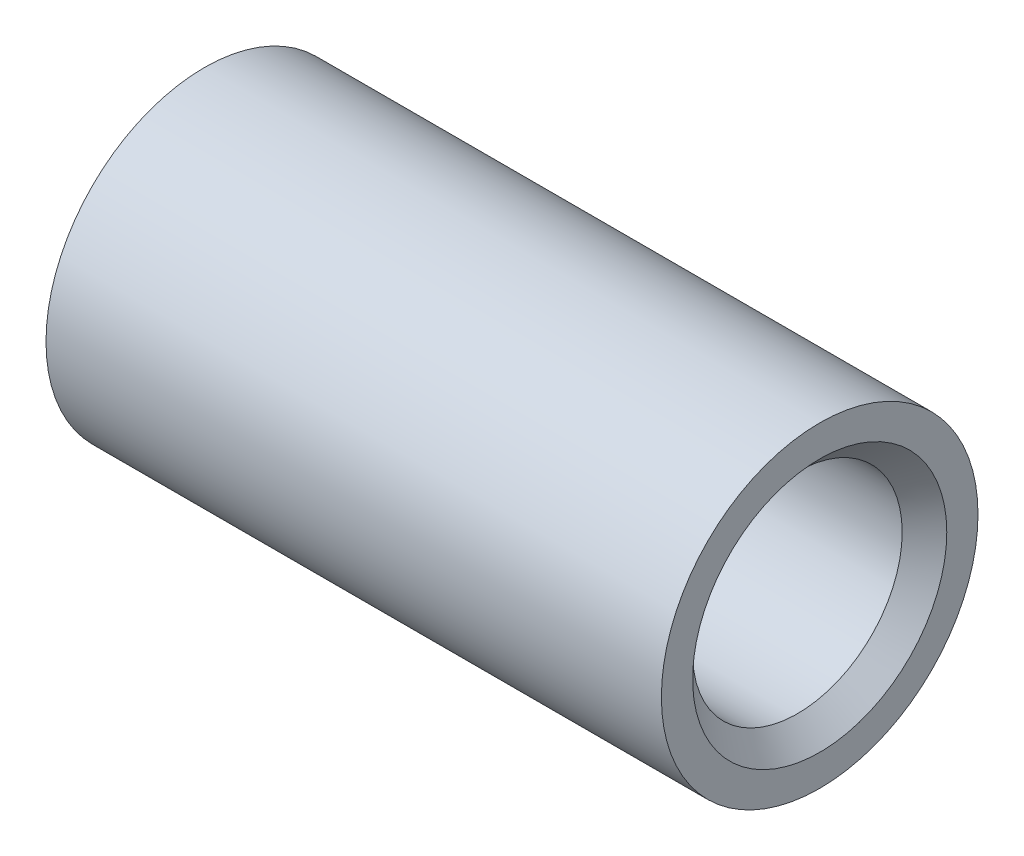
ISO-10303-21;
HEADER;
FILE_DESCRIPTION(('STEP AP214'),'2;1');
FILE_NAME('part.step','',(''),(''),'','','');
FILE_SCHEMA(('AUTOMOTIVE_DESIGN { 1 0 10303 214 1 1 1 1 }'));
ENDSEC;
DATA;
#1=APPLICATION_CONTEXT('core data for automotive mechanical design processes');
#2=APPLICATION_PROTOCOL_DEFINITION('international standard','automotive_design',2000,#1);
#3=PRODUCT_CONTEXT('',#1,'mechanical');
#4=PRODUCT('Part','Part','',(#3));
#5=PRODUCT_RELATED_PRODUCT_CATEGORY('part','',(#4));
#6=PRODUCT_DEFINITION_FORMATION('','',#4);
#7=PRODUCT_DEFINITION_CONTEXT('part definition',#1,'design');
#8=PRODUCT_DEFINITION('design','',#6,#7);
#9=PRODUCT_DEFINITION_SHAPE('','',#8);
#10=(LENGTH_UNIT() NAMED_UNIT(*) SI_UNIT(.MILLI.,.METRE.));
#11=(NAMED_UNIT(*) PLANE_ANGLE_UNIT() SI_UNIT($,.RADIAN.));
#12=(NAMED_UNIT(*) SI_UNIT($,.STERADIAN.) SOLID_ANGLE_UNIT());
#13=UNCERTAINTY_MEASURE_WITH_UNIT(LENGTH_MEASURE(1.E-05),#10,'distance_accuracy_value','');
#14=(GEOMETRIC_REPRESENTATION_CONTEXT(3) GLOBAL_UNCERTAINTY_ASSIGNED_CONTEXT((#13)) GLOBAL_UNIT_ASSIGNED_CONTEXT((#10,
#11,#12)) REPRESENTATION_CONTEXT('',''));
#15=CARTESIAN_POINT('',(0.,0.,0.));
#16=DIRECTION('',(0.,0.,1.));
#17=DIRECTION('',(1.,0.,0.));
#18=AXIS2_PLACEMENT_3D('',#15,#16,#17);
#19=CARTESIAN_POINT('',(-1.9,0.,0.));
#20=DIRECTION('',(-1.,0.,0.));
#21=DIRECTION('',(0.,0.,1.));
#22=AXIS2_PLACEMENT_3D('',#19,#20,#21);
#23=PLANE('',#22);
#24=CARTESIAN_POINT('',(-1.9,0.,0.));
#25=DIRECTION('',(1.,0.,0.));
#26=DIRECTION('',(0.,0.,-1.));
#27=AXIS2_PLACEMENT_3D('',#24,#25,#26);
#28=CIRCLE('',#27,2.35);
#29=CARTESIAN_POINT('',(-1.9,0.,-2.35));
#30=VERTEX_POINT('',#29);
#31=EDGE_CURVE('E10',#30,#30,#28,.T.);
#32=ORIENTED_EDGE('',*,*,#31,.F.);
#33=EDGE_LOOP('',(#32));
#34=FACE_BOUND('',#33,.T.);
#35=ADVANCED_FACE('F37',(#34),#23,.T.);
#36=CARTESIAN_POINT('',(0.,0.,0.));
#37=DIRECTION('',(1.,0.,0.));
#38=DIRECTION('',(0.,0.,-1.));
#39=AXIS2_PLACEMENT_3D('',#36,#37,#38);
#40=CYLINDRICAL_SURFACE('',#39,2.35);
#41=ORIENTED_EDGE('',*,*,#31,.T.);
#42=EDGE_LOOP('',(#41));
#43=FACE_BOUND('',#42,.T.);
#44=CARTESIAN_POINT('',(-6.4,0.,0.));
#45=DIRECTION('',(1.,0.,0.));
#46=DIRECTION('',(0.,0.,-1.));
#47=AXIS2_PLACEMENT_3D('',#44,#45,#46);
#48=CIRCLE('',#47,2.35);
#49=CARTESIAN_POINT('',(-6.4,0.,-2.35));
#50=VERTEX_POINT('',#49);
#51=EDGE_CURVE('E44',#50,#50,#48,.T.);
#52=ORIENTED_EDGE('',*,*,#51,.F.);
#53=EDGE_LOOP('',(#52));
#54=FACE_BOUND('',#53,.T.);
#55=ADVANCED_FACE('F93',(#43,#54),#40,.F.);
#56=CARTESIAN_POINT('',(-6.9,0.,0.));
#57=DIRECTION('',(-1.,0.,0.));
#58=DIRECTION('',(0.,0.,1.));
#59=AXIS2_PLACEMENT_3D('',#56,#57,#58);
#60=CONICAL_SURFACE('',#59,2.85,0.785398163397449);
#61=ORIENTED_EDGE('',*,*,#51,.T.);
#62=EDGE_LOOP('',(#61));
#63=FACE_BOUND('',#62,.T.);
#64=CARTESIAN_POINT('',(-6.9,0.,0.));
#65=DIRECTION('',(1.,0.,0.));
#66=DIRECTION('',(0.,0.,-1.));
#67=AXIS2_PLACEMENT_3D('',#64,#65,#66);
#68=CIRCLE('',#67,2.85);
#69=CARTESIAN_POINT('',(-6.9,0.,-2.85));
#70=VERTEX_POINT('',#69);
#71=EDGE_CURVE('E49',#70,#70,#68,.T.);
#72=ORIENTED_EDGE('',*,*,#71,.F.);
#73=EDGE_LOOP('',(#72));
#74=FACE_BOUND('',#73,.T.);
#75=ADVANCED_FACE('F98',(#63,#74),#60,.F.);
#76=CARTESIAN_POINT('',(-6.9,2.85,0.));
#77=DIRECTION('',(-1.,0.,0.));
#78=DIRECTION('',(0.,0.,1.));
#79=AXIS2_PLACEMENT_3D('',#76,#77,#78);
#80=PLANE('',#79);
#81=ORIENTED_EDGE('',*,*,#71,.T.);
#82=EDGE_LOOP('',(#81));
#83=FACE_BOUND('',#82,.T.);
#84=CARTESIAN_POINT('',(-6.9,0.,0.));
#85=DIRECTION('',(1.,0.,0.));
#86=DIRECTION('',(0.,0.,-1.));
#87=AXIS2_PLACEMENT_3D('',#84,#85,#86);
#88=CIRCLE('',#87,3.55);
#89=CARTESIAN_POINT('',(-6.9,0.,-3.55));
#90=VERTEX_POINT('',#89);
#91=EDGE_CURVE('E54',#90,#90,#88,.T.);
#92=ORIENTED_EDGE('',*,*,#91,.F.);
#93=EDGE_LOOP('',(#92));
#94=FACE_BOUND('',#93,.T.);
#95=ADVANCED_FACE('F102',(#83,#94),#80,.T.);
#96=CARTESIAN_POINT('',(0.,0.,0.));
#97=DIRECTION('',(1.,0.,0.));
#98=DIRECTION('',(0.,0.,-1.));
#99=AXIS2_PLACEMENT_3D('',#96,#97,#98);
#100=CYLINDRICAL_SURFACE('',#99,3.55);
#101=ORIENTED_EDGE('',*,*,#91,.T.);
#102=EDGE_LOOP('',(#101));
#103=FACE_BOUND('',#102,.T.);
#104=CARTESIAN_POINT('',(6.9,0.,0.));
#105=DIRECTION('',(1.,0.,0.));
#106=DIRECTION('',(0.,0.,-1.));
#107=AXIS2_PLACEMENT_3D('',#104,#105,#106);
#108=CIRCLE('',#107,3.55);
#109=CARTESIAN_POINT('',(6.9,0.,-3.55));
#110=VERTEX_POINT('',#109);
#111=EDGE_CURVE('E60',#110,#110,#108,.T.);
#112=ORIENTED_EDGE('',*,*,#111,.F.);
#113=EDGE_LOOP('',(#112));
#114=FACE_BOUND('',#113,.T.);
#115=ADVANCED_FACE('F108',(#103,#114),#100,.T.);
#116=CARTESIAN_POINT('',(6.9,3.55,0.));
#117=DIRECTION('',(1.,0.,0.));
#118=DIRECTION('',(0.,0.,-1.));
#119=AXIS2_PLACEMENT_3D('',#116,#117,#118);
#120=PLANE('',#119);
#121=ORIENTED_EDGE('',*,*,#111,.T.);
#122=EDGE_LOOP('',(#121));
#123=FACE_BOUND('',#122,.T.);
#124=CARTESIAN_POINT('',(6.9,0.,0.));
#125=DIRECTION('',(1.,0.,0.));
#126=DIRECTION('',(0.,0.,-1.));
#127=AXIS2_PLACEMENT_3D('',#124,#125,#126);
#128=CIRCLE('',#127,2.85);
#129=CARTESIAN_POINT('',(6.9,0.,-2.85));
#130=VERTEX_POINT('',#129);
#131=EDGE_CURVE('E64',#130,#130,#128,.T.);
#132=ORIENTED_EDGE('',*,*,#131,.F.);
#133=EDGE_LOOP('',(#132));
#134=FACE_BOUND('',#133,.T.);
#135=ADVANCED_FACE('F89',(#123,#134),#120,.T.);
#136=CARTESIAN_POINT('',(6.4,0.,0.));
#137=DIRECTION('',(1.,0.,0.));
#138=DIRECTION('',(0.,0.,-1.));
#139=AXIS2_PLACEMENT_3D('',#136,#137,#138);
#140=CONICAL_SURFACE('',#139,2.35,0.785398163397449);
#141=ORIENTED_EDGE('',*,*,#131,.T.);
#142=EDGE_LOOP('',(#141));
#143=FACE_BOUND('',#142,.T.);
#144=CARTESIAN_POINT('',(6.4,0.,0.));
#145=DIRECTION('',(1.,0.,0.));
#146=DIRECTION('',(0.,0.,-1.));
#147=AXIS2_PLACEMENT_3D('',#144,#145,#146);
#148=CIRCLE('',#147,2.35);
#149=CARTESIAN_POINT('',(6.4,0.,-2.35));
#150=VERTEX_POINT('',#149);
#151=EDGE_CURVE('E68',#150,#150,#148,.T.);
#152=ORIENTED_EDGE('',*,*,#151,.F.);
#153=EDGE_LOOP('',(#152));
#154=FACE_BOUND('',#153,.T.);
#155=ADVANCED_FACE('F81',(#143,#154),#140,.F.);
#156=CARTESIAN_POINT('',(0.,0.,0.));
#157=DIRECTION('',(1.,0.,0.));
#158=DIRECTION('',(0.,0.,-1.));
#159=AXIS2_PLACEMENT_3D('',#156,#157,#158);
#160=CYLINDRICAL_SURFACE('',#159,2.35);
#161=ORIENTED_EDGE('',*,*,#151,.T.);
#162=EDGE_LOOP('',(#161));
#163=FACE_BOUND('',#162,.T.);
#164=CARTESIAN_POINT('',(1.9,0.,0.));
#165=DIRECTION('',(1.,0.,0.));
#166=DIRECTION('',(0.,0.,-1.));
#167=AXIS2_PLACEMENT_3D('',#164,#165,#166);
#168=CIRCLE('',#167,2.35);
#169=CARTESIAN_POINT('',(1.9,0.,-2.35));
#170=VERTEX_POINT('',#169);
#171=EDGE_CURVE('E72',#170,#170,#168,.T.);
#172=ORIENTED_EDGE('',*,*,#171,.F.);
#173=EDGE_LOOP('',(#172));
#174=FACE_BOUND('',#173,.T.);
#175=ADVANCED_FACE('F79',(#163,#174),#160,.F.);
#176=CARTESIAN_POINT('',(1.9,2.35,0.));
#177=DIRECTION('',(1.,0.,0.));
#178=DIRECTION('',(0.,0.,-1.));
#179=AXIS2_PLACEMENT_3D('',#176,#177,#178);
#180=PLANE('',#179);
#181=ORIENTED_EDGE('',*,*,#171,.T.);
#182=EDGE_LOOP('',(#181));
#183=FACE_BOUND('',#182,.T.);
#184=ADVANCED_FACE('F77',(#183),#180,.T.);
#185=CLOSED_SHELL('',(#35,#55,#75,#95,#115,#135,#155,#175,#184));
#186=MANIFOLD_SOLID_BREP('B2',#185);
#187=ADVANCED_BREP_SHAPE_REPRESENTATION('',(#18,#186),#14);
#188=SHAPE_DEFINITION_REPRESENTATION(#9,#187);
ENDSEC;
END-ISO-10303-21;
